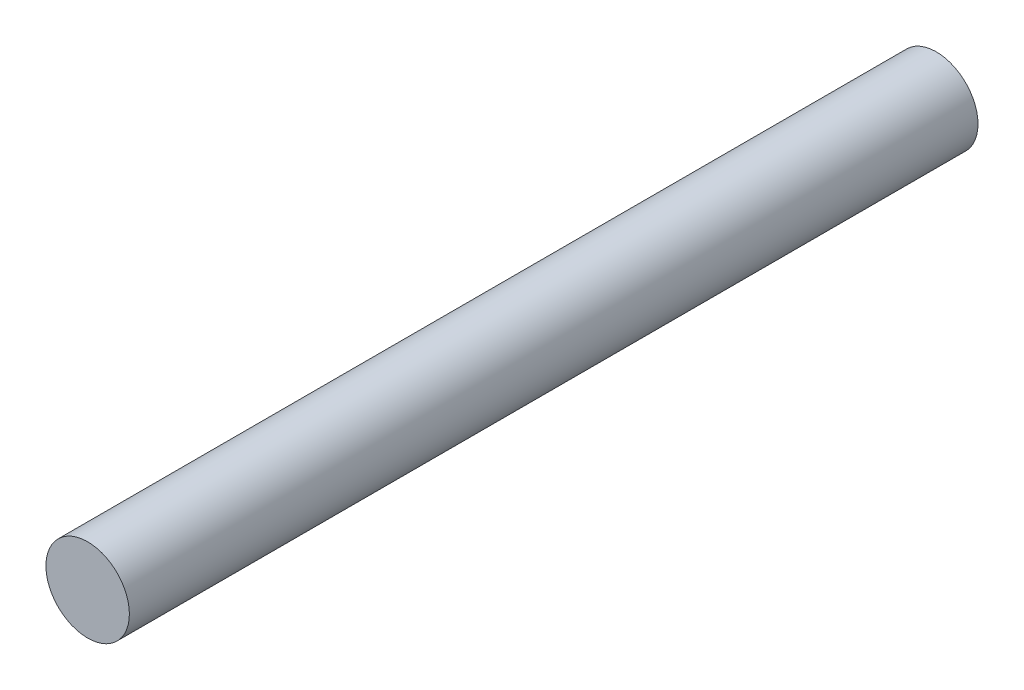
ISO-10303-21;
HEADER;
FILE_DESCRIPTION(('STEP AP214'),'2;1');
FILE_NAME('part.step','',(''),(''),'','','');
FILE_SCHEMA(('AUTOMOTIVE_DESIGN { 1 0 10303 214 1 1 1 1 }'));
ENDSEC;
DATA;
#1=APPLICATION_CONTEXT('core data for automotive mechanical design processes');
#2=APPLICATION_PROTOCOL_DEFINITION('international standard','automotive_design',2000,#1);
#3=PRODUCT_CONTEXT('',#1,'mechanical');
#4=PRODUCT('Part','Part','',(#3));
#5=PRODUCT_RELATED_PRODUCT_CATEGORY('part','',(#4));
#6=PRODUCT_DEFINITION_FORMATION('','',#4);
#7=PRODUCT_DEFINITION_CONTEXT('part definition',#1,'design');
#8=PRODUCT_DEFINITION('design','',#6,#7);
#9=PRODUCT_DEFINITION_SHAPE('','',#8);
#10=(LENGTH_UNIT() NAMED_UNIT(*) SI_UNIT(.MILLI.,.METRE.));
#11=(NAMED_UNIT(*) PLANE_ANGLE_UNIT() SI_UNIT($,.RADIAN.));
#12=(NAMED_UNIT(*) SI_UNIT($,.STERADIAN.) SOLID_ANGLE_UNIT());
#13=UNCERTAINTY_MEASURE_WITH_UNIT(LENGTH_MEASURE(1.E-05),#10,'distance_accuracy_value','');
#14=(GEOMETRIC_REPRESENTATION_CONTEXT(3) GLOBAL_UNCERTAINTY_ASSIGNED_CONTEXT((#13)) GLOBAL_UNIT_ASSIGNED_CONTEXT((#10,
#11,#12)) REPRESENTATION_CONTEXT('',''));
#15=CARTESIAN_POINT('',(0.,0.,0.));
#16=DIRECTION('',(0.,0.,1.));
#17=DIRECTION('',(1.,0.,0.));
#18=AXIS2_PLACEMENT_3D('',#15,#16,#17);
#19=CARTESIAN_POINT('',(-0.364847958219269,-188.000481982774,600.));
#20=DIRECTION('',(0.,0.,-1.));
#21=DIRECTION('',(-1.,0.,0.));
#22=AXIS2_PLACEMENT_3D('',#19,#20,#21);
#23=CYLINDRICAL_SURFACE('',#22,29.5);
#24=CARTESIAN_POINT('',(-0.364847958219269,-188.000481982774,600.));
#25=DIRECTION('',(0.,0.,1.));
#26=DIRECTION('',(1.,0.,0.));
#27=AXIS2_PLACEMENT_3D('',#24,#25,#26);
#28=CIRCLE('',#27,29.5);
#29=CARTESIAN_POINT('',(29.1351520417807,-188.000481982774,600.));
#30=VERTEX_POINT('',#29);
#31=EDGE_CURVE('E10',#30,#30,#28,.T.);
#32=ORIENTED_EDGE('',*,*,#31,.F.);
#33=EDGE_LOOP('',(#32));
#34=FACE_BOUND('',#33,.T.);
#35=CARTESIAN_POINT('',(-0.364847958219269,-188.000481982774,0.));
#36=DIRECTION('',(0.,0.,1.));
#37=DIRECTION('',(1.,0.,0.));
#38=AXIS2_PLACEMENT_3D('',#35,#36,#37);
#39=CIRCLE('',#38,29.5);
#40=CARTESIAN_POINT('',(29.1351520417807,-188.000481982774,0.));
#41=VERTEX_POINT('',#40);
#42=EDGE_CURVE('E38',#41,#41,#39,.T.);
#43=ORIENTED_EDGE('',*,*,#42,.T.);
#44=EDGE_LOOP('',(#43));
#45=FACE_BOUND('',#44,.T.);
#46=ADVANCED_FACE('F35',(#34,#45),#23,.T.);
#47=CARTESIAN_POINT('',(-0.364847958219269,-188.000481982774,600.));
#48=DIRECTION('',(0.,0.,1.));
#49=DIRECTION('',(1.,0.,0.));
#50=AXIS2_PLACEMENT_3D('',#47,#48,#49);
#51=PLANE('',#50);
#52=ORIENTED_EDGE('',*,*,#31,.T.);
#53=EDGE_LOOP('',(#52));
#54=FACE_BOUND('',#53,.T.);
#55=ADVANCED_FACE('F50',(#54),#51,.T.);
#56=CARTESIAN_POINT('',(-0.364847958219269,-188.000481982774,0.));
#57=DIRECTION('',(0.,0.,1.));
#58=DIRECTION('',(1.,0.,0.));
#59=AXIS2_PLACEMENT_3D('',#56,#57,#58);
#60=PLANE('',#59);
#61=ORIENTED_EDGE('',*,*,#42,.F.);
#62=EDGE_LOOP('',(#61));
#63=FACE_BOUND('',#62,.T.);
#64=ADVANCED_FACE('F48',(#63),#60,.F.);
#65=CLOSED_SHELL('',(#46,#55,#64));
#66=MANIFOLD_SOLID_BREP('B2',#65);
#67=ADVANCED_BREP_SHAPE_REPRESENTATION('',(#18,#66),#14);
#68=SHAPE_DEFINITION_REPRESENTATION(#9,#67);
ENDSEC;
END-ISO-10303-21;
